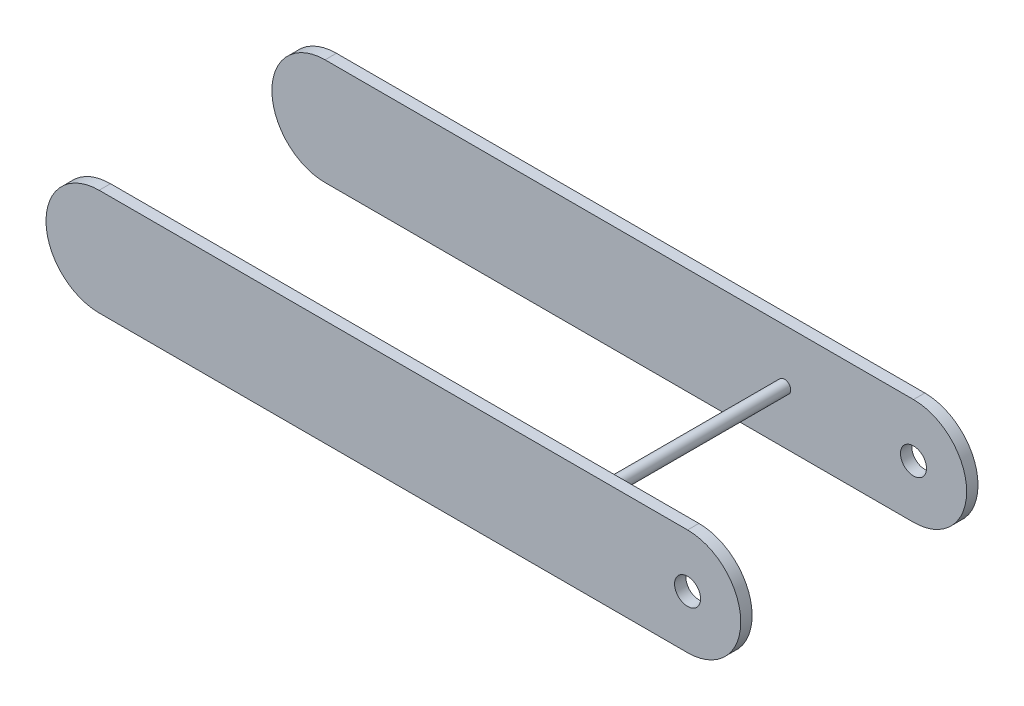
ISO-10303-21;
HEADER;
FILE_DESCRIPTION(('STEP AP214'),'2;1');
FILE_NAME('part.step','',(''),(''),'','','');
FILE_SCHEMA(('AUTOMOTIVE_DESIGN { 1 0 10303 214 1 1 1 1 }'));
ENDSEC;
DATA;
#1=APPLICATION_CONTEXT('core data for automotive mechanical design processes');
#2=APPLICATION_PROTOCOL_DEFINITION('international standard','automotive_design',2000,#1);
#3=PRODUCT_CONTEXT('',#1,'mechanical');
#4=PRODUCT('Part','Part','',(#3));
#5=PRODUCT_RELATED_PRODUCT_CATEGORY('part','',(#4));
#6=PRODUCT_DEFINITION_FORMATION('','',#4);
#7=PRODUCT_DEFINITION_CONTEXT('part definition',#1,'design');
#8=PRODUCT_DEFINITION('design','',#6,#7);
#9=PRODUCT_DEFINITION_SHAPE('','',#8);
#10=(LENGTH_UNIT() NAMED_UNIT(*) SI_UNIT(.MILLI.,.METRE.));
#11=(NAMED_UNIT(*) PLANE_ANGLE_UNIT() SI_UNIT($,.RADIAN.));
#12=(NAMED_UNIT(*) SI_UNIT($,.STERADIAN.) SOLID_ANGLE_UNIT());
#13=UNCERTAINTY_MEASURE_WITH_UNIT(LENGTH_MEASURE(1.E-05),#10,'distance_accuracy_value','');
#14=(GEOMETRIC_REPRESENTATION_CONTEXT(3) GLOBAL_UNCERTAINTY_ASSIGNED_CONTEXT((#13)) GLOBAL_UNIT_ASSIGNED_CONTEXT((#10,
#11,#12)) REPRESENTATION_CONTEXT('',''));
#15=CARTESIAN_POINT('',(0.,0.,0.));
#16=DIRECTION('',(0.,0.,1.));
#17=DIRECTION('',(1.,0.,0.));
#18=AXIS2_PLACEMENT_3D('',#15,#16,#17);
#19=CARTESIAN_POINT('',(-149.578947368421,-25.3,5.4));
#20=DIRECTION('',(0.,0.,1.));
#21=DIRECTION('',(1.,0.,0.));
#22=AXIS2_PLACEMENT_3D('',#19,#20,#21);
#23=PLANE('',#22);
#24=DIRECTION('',(-1.,0.,0.));
#25=VECTOR('',#24,1.);
#26=CARTESIAN_POINT('',(130.421052631579,0.,5.4));
#27=LINE('',#26,#25);
#28=CARTESIAN_POINT('',(130.421052631579,0.,5.4));
#29=VERTEX_POINT('',#28);
#30=CARTESIAN_POINT('',(-149.578947368421,0.,5.4));
#31=VERTEX_POINT('',#30);
#32=EDGE_CURVE('E80',#29,#31,#27,.T.);
#33=ORIENTED_EDGE('',*,*,#32,.T.);
#34=CARTESIAN_POINT('',(-149.578947368421,-25.3,5.4));
#35=DIRECTION('',(0.,0.,1.));
#36=DIRECTION('',(1.,0.,0.));
#37=AXIS2_PLACEMENT_3D('',#34,#35,#36);
#38=CIRCLE('',#37,25.3);
#39=CARTESIAN_POINT('',(-149.578947368421,-50.6,5.4));
#40=VERTEX_POINT('',#39);
#41=EDGE_CURVE('E149',#31,#40,#38,.T.);
#42=ORIENTED_EDGE('',*,*,#41,.T.);
#43=DIRECTION('',(1.,0.,0.));
#44=VECTOR('',#43,1.);
#45=CARTESIAN_POINT('',(-149.578947368421,-50.6,5.4));
#46=LINE('',#45,#44);
#47=CARTESIAN_POINT('',(130.421052631579,-50.6,5.4));
#48=VERTEX_POINT('',#47);
#49=EDGE_CURVE('E152',#40,#48,#46,.T.);
#50=ORIENTED_EDGE('',*,*,#49,.T.);
#51=CARTESIAN_POINT('',(130.421052631579,-25.3,5.4));
#52=DIRECTION('',(0.,0.,1.));
#53=DIRECTION('',(1.,0.,0.));
#54=AXIS2_PLACEMENT_3D('',#51,#52,#53);
#55=CIRCLE('',#54,25.3);
#56=EDGE_CURVE('E50',#48,#29,#55,.T.);
#57=ORIENTED_EDGE('',*,*,#56,.T.);
#58=EDGE_LOOP('',(#33,#42,#50,#57));
#59=FACE_BOUND('',#58,.T.);
#60=CARTESIAN_POINT('',(130.421052631579,-25.3,5.4));
#61=DIRECTION('',(0.,0.,1.));
#62=DIRECTION('',(1.,0.,0.));
#63=AXIS2_PLACEMENT_3D('',#60,#61,#62);
#64=CIRCLE('',#63,6.2);
#65=CARTESIAN_POINT('',(124.221052631579,-25.3,5.4));
#66=VERTEX_POINT('',#65);
#67=EDGE_CURVE('E143',#66,#66,#64,.T.);
#68=ORIENTED_EDGE('',*,*,#67,.F.);
#69=EDGE_LOOP('',(#68));
#70=FACE_BOUND('',#69,.T.);
#71=ADVANCED_FACE('F33',(#59,#70),#23,.T.);
#72=CARTESIAN_POINT('',(-149.578947368421,-25.3,0.));
#73=DIRECTION('',(0.,0.,1.));
#74=DIRECTION('',(1.,0.,0.));
#75=AXIS2_PLACEMENT_3D('',#72,#73,#74);
#76=PLANE('',#75);
#77=CARTESIAN_POINT('',(68.9858099662511,-25.3,0.));
#78=DIRECTION('',(0.,0.,1.));
#79=DIRECTION('',(1.,0.,0.));
#80=AXIS2_PLACEMENT_3D('',#77,#78,#79);
#81=CIRCLE('',#80,2.99999999999999);
#82=CARTESIAN_POINT('',(71.9858099662511,-25.3,0.));
#83=VERTEX_POINT('',#82);
#84=EDGE_CURVE('E11',#83,#83,#81,.F.);
#85=ORIENTED_EDGE('',*,*,#84,.F.);
#86=EDGE_LOOP('',(#85));
#87=FACE_BOUND('',#86,.T.);
#88=DIRECTION('',(-1.,0.,0.));
#89=VECTOR('',#88,1.);
#90=CARTESIAN_POINT('',(0.,0.,0.));
#91=LINE('',#90,#89);
#92=CARTESIAN_POINT('',(130.421052631579,0.,0.));
#93=VERTEX_POINT('',#92);
#94=CARTESIAN_POINT('',(-149.578947368421,0.,0.));
#95=VERTEX_POINT('',#94);
#96=EDGE_CURVE('E75',#93,#95,#91,.T.);
#97=ORIENTED_EDGE('',*,*,#96,.F.);
#98=CARTESIAN_POINT('',(130.421052631579,-25.3,0.));
#99=DIRECTION('',(0.,0.,1.));
#100=DIRECTION('',(1.,0.,0.));
#101=AXIS2_PLACEMENT_3D('',#98,#99,#100);
#102=CIRCLE('',#101,25.3);
#103=CARTESIAN_POINT('',(130.421052631579,-50.6,0.));
#104=VERTEX_POINT('',#103);
#105=EDGE_CURVE('E150',#104,#93,#102,.T.);
#106=ORIENTED_EDGE('',*,*,#105,.F.);
#107=DIRECTION('',(1.,0.,0.));
#108=VECTOR('',#107,1.);
#109=CARTESIAN_POINT('',(-149.578947368421,-50.6,0.));
#110=LINE('',#109,#108);
#111=CARTESIAN_POINT('',(-149.578947368421,-50.6,0.));
#112=VERTEX_POINT('',#111);
#113=EDGE_CURVE('E68',#112,#104,#110,.T.);
#114=ORIENTED_EDGE('',*,*,#113,.F.);
#115=CARTESIAN_POINT('',(-149.578947368421,-25.3,0.));
#116=DIRECTION('',(0.,0.,1.));
#117=DIRECTION('',(1.,0.,0.));
#118=AXIS2_PLACEMENT_3D('',#115,#116,#117);
#119=CIRCLE('',#118,25.3);
#120=EDGE_CURVE('E157',#95,#112,#119,.T.);
#121=ORIENTED_EDGE('',*,*,#120,.F.);
#122=EDGE_LOOP('',(#97,#106,#114,#121));
#123=FACE_BOUND('',#122,.T.);
#124=CARTESIAN_POINT('',(130.421052631579,-25.3,0.));
#125=DIRECTION('',(0.,0.,1.));
#126=DIRECTION('',(1.,0.,0.));
#127=AXIS2_PLACEMENT_3D('',#124,#125,#126);
#128=CIRCLE('',#127,6.2);
#129=CARTESIAN_POINT('',(124.221052631579,-25.3,0.));
#130=VERTEX_POINT('',#129);
#131=EDGE_CURVE('E137',#130,#130,#128,.T.);
#132=ORIENTED_EDGE('',*,*,#131,.T.);
#133=EDGE_LOOP('',(#132));
#134=FACE_BOUND('',#133,.T.);
#135=ADVANCED_FACE('F172',(#87,#123,#134),#76,.F.);
#136=CARTESIAN_POINT('',(0.,0.,5.4));
#137=DIRECTION('',(0.,-1.,0.));
#138=DIRECTION('',(0.,0.,-1.));
#139=AXIS2_PLACEMENT_3D('',#136,#137,#138);
#140=PLANE('',#139);
#141=ORIENTED_EDGE('',*,*,#96,.T.);
#142=DIRECTION('',(0.,0.,-1.));
#143=VECTOR('',#142,1.);
#144=CARTESIAN_POINT('',(-149.578947368421,0.,5.4));
#145=LINE('',#144,#143);
#146=EDGE_CURVE('E42',#31,#95,#145,.T.);
#147=ORIENTED_EDGE('',*,*,#146,.F.);
#148=ORIENTED_EDGE('',*,*,#32,.F.);
#149=DIRECTION('',(0.,0.,-1.));
#150=VECTOR('',#149,1.);
#151=CARTESIAN_POINT('',(130.421052631579,0.,5.4));
#152=LINE('',#151,#150);
#153=EDGE_CURVE('E155',#29,#93,#152,.T.);
#154=ORIENTED_EDGE('',*,*,#153,.T.);
#155=EDGE_LOOP('',(#141,#147,#148,#154));
#156=FACE_BOUND('',#155,.T.);
#157=ADVANCED_FACE('F35',(#156),#140,.F.);
#158=CARTESIAN_POINT('',(-149.578947368421,-25.3,5.4));
#159=DIRECTION('',(0.,0.,-1.));
#160=DIRECTION('',(-1.,0.,0.));
#161=AXIS2_PLACEMENT_3D('',#158,#159,#160);
#162=CYLINDRICAL_SURFACE('',#161,25.3);
#163=ORIENTED_EDGE('',*,*,#120,.T.);
#164=DIRECTION('',(0.,0.,-1.));
#165=VECTOR('',#164,1.);
#166=CARTESIAN_POINT('',(-149.578947368421,-50.6,5.4));
#167=LINE('',#166,#165);
#168=EDGE_CURVE('E165',#40,#112,#167,.T.);
#169=ORIENTED_EDGE('',*,*,#168,.F.);
#170=ORIENTED_EDGE('',*,*,#41,.F.);
#171=ORIENTED_EDGE('',*,*,#146,.T.);
#172=EDGE_LOOP('',(#163,#169,#170,#171));
#173=FACE_BOUND('',#172,.T.);
#174=ADVANCED_FACE('F169',(#173),#162,.T.);
#175=CARTESIAN_POINT('',(-149.578947368421,-50.6,5.4));
#176=DIRECTION('',(0.,1.,0.));
#177=DIRECTION('',(-1.,0.,0.));
#178=AXIS2_PLACEMENT_3D('',#175,#176,#177);
#179=PLANE('',#178);
#180=ORIENTED_EDGE('',*,*,#113,.T.);
#181=DIRECTION('',(0.,0.,-1.));
#182=VECTOR('',#181,1.);
#183=CARTESIAN_POINT('',(130.421052631579,-50.6,5.4));
#184=LINE('',#183,#182);
#185=EDGE_CURVE('E163',#48,#104,#184,.T.);
#186=ORIENTED_EDGE('',*,*,#185,.F.);
#187=ORIENTED_EDGE('',*,*,#49,.F.);
#188=ORIENTED_EDGE('',*,*,#168,.T.);
#189=EDGE_LOOP('',(#180,#186,#187,#188));
#190=FACE_BOUND('',#189,.T.);
#191=ADVANCED_FACE('F181',(#190),#179,.F.);
#192=CARTESIAN_POINT('',(130.421052631579,-25.3,5.4));
#193=DIRECTION('',(0.,0.,-1.));
#194=DIRECTION('',(-1.,0.,0.));
#195=AXIS2_PLACEMENT_3D('',#192,#193,#194);
#196=CYLINDRICAL_SURFACE('',#195,25.3);
#197=ORIENTED_EDGE('',*,*,#105,.T.);
#198=ORIENTED_EDGE('',*,*,#153,.F.);
#199=ORIENTED_EDGE('',*,*,#56,.F.);
#200=ORIENTED_EDGE('',*,*,#185,.T.);
#201=EDGE_LOOP('',(#197,#198,#199,#200));
#202=FACE_BOUND('',#201,.T.);
#203=ADVANCED_FACE('F175',(#202),#196,.T.);
#204=CARTESIAN_POINT('',(130.421052631579,-25.3,5.4));
#205=DIRECTION('',(0.,0.,-1.));
#206=DIRECTION('',(-1.,0.,0.));
#207=AXIS2_PLACEMENT_3D('',#204,#205,#206);
#208=CYLINDRICAL_SURFACE('',#207,6.2);
#209=CARTESIAN_POINT('',(124.221052631579,-25.3,5.4));
#210=CARTESIAN_POINT('',(124.221052631579,-25.3,5.34375));
#211=CARTESIAN_POINT('',(124.221052631579,-25.3,5.2875));
#212=CARTESIAN_POINT('',(124.221052631579,-25.3,5.175));
#213=CARTESIAN_POINT('',(124.221052631579,-25.3,5.11875));
#214=CARTESIAN_POINT('',(124.221052631579,-25.3,5.00625));
#215=CARTESIAN_POINT('',(124.221052631579,-25.3,4.95));
#216=CARTESIAN_POINT('',(124.221052631579,-25.3,4.8375));
#217=CARTESIAN_POINT('',(124.221052631579,-25.3,4.78125));
#218=CARTESIAN_POINT('',(124.221052631579,-25.3,4.66875));
#219=CARTESIAN_POINT('',(124.221052631579,-25.3,4.6125));
#220=CARTESIAN_POINT('',(124.221052631579,-25.3,4.5));
#221=CARTESIAN_POINT('',(124.221052631579,-25.3,4.44375));
#222=CARTESIAN_POINT('',(124.221052631579,-25.3,4.33125));
#223=CARTESIAN_POINT('',(124.221052631579,-25.3,4.275));
#224=CARTESIAN_POINT('',(124.221052631579,-25.3,4.1625));
#225=CARTESIAN_POINT('',(124.221052631579,-25.3,4.10625));
#226=CARTESIAN_POINT('',(124.221052631579,-25.3,3.99375));
#227=CARTESIAN_POINT('',(124.221052631579,-25.3,3.9375));
#228=CARTESIAN_POINT('',(124.221052631579,-25.3,3.825));
#229=CARTESIAN_POINT('',(124.221052631579,-25.3,3.76875));
#230=CARTESIAN_POINT('',(124.221052631579,-25.3,3.65625));
#231=CARTESIAN_POINT('',(124.221052631579,-25.3,3.6));
#232=CARTESIAN_POINT('',(124.221052631579,-25.3,3.4875));
#233=CARTESIAN_POINT('',(124.221052631579,-25.3,3.43125));
#234=CARTESIAN_POINT('',(124.221052631579,-25.3,3.31875));
#235=CARTESIAN_POINT('',(124.221052631579,-25.3,3.2625));
#236=CARTESIAN_POINT('',(124.221052631579,-25.3,3.15));
#237=CARTESIAN_POINT('',(124.221052631579,-25.3,3.09375));
#238=CARTESIAN_POINT('',(124.221052631579,-25.3,2.98125));
#239=CARTESIAN_POINT('',(124.221052631579,-25.3,2.925));
#240=CARTESIAN_POINT('',(124.221052631579,-25.3,2.8125));
#241=CARTESIAN_POINT('',(124.221052631579,-25.3,2.75625));
#242=CARTESIAN_POINT('',(124.221052631579,-25.3,2.64375));
#243=CARTESIAN_POINT('',(124.221052631579,-25.3,2.5875));
#244=CARTESIAN_POINT('',(124.221052631579,-25.3,2.475));
#245=CARTESIAN_POINT('',(124.221052631579,-25.3,2.41875));
#246=CARTESIAN_POINT('',(124.221052631579,-25.3,2.30625));
#247=CARTESIAN_POINT('',(124.221052631579,-25.3,2.25));
#248=CARTESIAN_POINT('',(124.221052631579,-25.3,2.1375));
#249=CARTESIAN_POINT('',(124.221052631579,-25.3,2.08125));
#250=CARTESIAN_POINT('',(124.221052631579,-25.3,1.96875));
#251=CARTESIAN_POINT('',(124.221052631579,-25.3,1.9125));
#252=CARTESIAN_POINT('',(124.221052631579,-25.3,1.8));
#253=CARTESIAN_POINT('',(124.221052631579,-25.3,1.74375));
#254=CARTESIAN_POINT('',(124.221052631579,-25.3,1.63125));
#255=CARTESIAN_POINT('',(124.221052631579,-25.3,1.575));
#256=CARTESIAN_POINT('',(124.221052631579,-25.3,1.4625));
#257=CARTESIAN_POINT('',(124.221052631579,-25.3,1.40625));
#258=CARTESIAN_POINT('',(124.221052631579,-25.3,1.29375));
#259=CARTESIAN_POINT('',(124.221052631579,-25.3,1.2375));
#260=CARTESIAN_POINT('',(124.221052631579,-25.3,1.125));
#261=CARTESIAN_POINT('',(124.221052631579,-25.3,1.06875));
#262=CARTESIAN_POINT('',(124.221052631579,-25.3,0.95625));
#263=CARTESIAN_POINT('',(124.221052631579,-25.3,0.9));
#264=CARTESIAN_POINT('',(124.221052631579,-25.3,0.7875));
#265=CARTESIAN_POINT('',(124.221052631579,-25.3,0.73125));
#266=CARTESIAN_POINT('',(124.221052631579,-25.3,0.618749999999999));
#267=CARTESIAN_POINT('',(124.221052631579,-25.3,0.562499999999999));
#268=CARTESIAN_POINT('',(124.221052631579,-25.3,0.449999999999999));
#269=CARTESIAN_POINT('',(124.221052631579,-25.3,0.393749999999999));
#270=CARTESIAN_POINT('',(124.221052631579,-25.3,0.281249999999999));
#271=CARTESIAN_POINT('',(124.221052631579,-25.3,0.225));
#272=CARTESIAN_POINT('',(124.221052631579,-25.3,0.112499999999999));
#273=CARTESIAN_POINT('',(124.221052631579,-25.3,0.0562499999999992));
#274=CARTESIAN_POINT('',(124.221052631579,-25.3,0.));
#275=B_SPLINE_CURVE_WITH_KNOTS('',3,(#209,#210,#211,#212,#213,#214,#215,#216,#217,#218,#219,
#220,#221,#222,#223,#224,#225,#226,#227,#228,#229,#230,#231,#232,#233,#234,#235,#236,#237,#238,
#239,#240,#241,#242,#243,#244,#245,#246,#247,#248,#249,#250,#251,#252,#253,#254,#255,#256,#257,
#258,#259,#260,#261,#262,#263,#264,#265,#266,#267,#268,#269,#270,#271,#272,#273,#274),
.UNSPECIFIED.,.F.,.F.,(4,2,2,2,2,2,2,2,2,2,2,2,2,2,2,2,2,2,2,2,2,2,2,2,2,2,2,2,2,2,2,2,4),(0.,
0.168750000000001,0.3375,0.506250000000001,0.675,0.843750000000001,1.0125,1.18125,1.35,1.51875,
1.6875,1.85625,2.025,2.19375,2.3625,2.53125,2.7,2.86875,3.0375,3.20625,3.375,3.54375,3.7125,
3.88125,4.05,4.21875,4.3875,4.55625,4.725,4.89375,5.0625,5.23125,5.4),.UNSPECIFIED.);
#276=EDGE_CURVE('BSEAM190',#66,#130,#275,.T.);
#277=ORIENTED_EDGE('',*,*,#67,.T.);
#278=ORIENTED_EDGE('',*,*,#131,.F.);
#279=ORIENTED_EDGE('',*,*,#276,.T.);
#280=ORIENTED_EDGE('',*,*,#276,.F.);
#281=EDGE_LOOP('',(#277,#279,#278,#280));
#282=FACE_BOUND('',#281,.T.);
#283=ADVANCED_FACE('F190',(#282),#208,.F.);
#284=CARTESIAN_POINT('',(68.9858099662511,-25.3,-102.1));
#285=DIRECTION('',(0.,0.,1.));
#286=DIRECTION('',(1.,0.,0.));
#287=AXIS2_PLACEMENT_3D('',#284,#285,#286);
#288=CYLINDRICAL_SURFACE('',#287,2.99999999999999);
#289=CARTESIAN_POINT('',(68.9858099662511,-25.3,-102.1));
#290=DIRECTION('',(0.,0.,-1.));
#291=DIRECTION('',(-1.,0.,0.));
#292=AXIS2_PLACEMENT_3D('',#289,#290,#291);
#293=CIRCLE('',#292,2.99999999999999);
#294=CARTESIAN_POINT('',(65.9858099662511,-25.3,-102.1));
#295=VERTEX_POINT('',#294);
#296=EDGE_CURVE('E134',#295,#295,#293,.T.);
#297=ORIENTED_EDGE('',*,*,#296,.F.);
#298=EDGE_LOOP('',(#297));
#299=FACE_BOUND('',#298,.T.);
#300=ORIENTED_EDGE('',*,*,#84,.T.);
#301=EDGE_LOOP('',(#300));
#302=FACE_BOUND('',#301,.T.);
#303=ADVANCED_FACE('F210',(#299,#302),#288,.T.);
#304=CARTESIAN_POINT('',(130.421052631579,-25.3,-107.5));
#305=DIRECTION('',(0.,0.,1.));
#306=DIRECTION('',(1.,0.,0.));
#307=AXIS2_PLACEMENT_3D('',#304,#305,#306);
#308=PLANE('',#307);
#309=CARTESIAN_POINT('',(130.421052631579,-25.3,-107.5));
#310=DIRECTION('',(0.,0.,-1.));
#311=DIRECTION('',(1.,0.,0.));
#312=AXIS2_PLACEMENT_3D('',#309,#310,#311);
#313=CIRCLE('',#312,25.3);
#314=CARTESIAN_POINT('',(130.421052631579,0.,-107.5));
#315=VERTEX_POINT('',#314);
#316=CARTESIAN_POINT('',(130.421052631579,-50.6,-107.5));
#317=VERTEX_POINT('',#316);
#318=EDGE_CURVE('E119',#315,#317,#313,.T.);
#319=ORIENTED_EDGE('',*,*,#318,.T.);
#320=DIRECTION('',(-1.,0.,0.));
#321=VECTOR('',#320,1.);
#322=CARTESIAN_POINT('',(-149.578947368421,-50.6,-107.5));
#323=LINE('',#322,#321);
#324=CARTESIAN_POINT('',(-149.578947368421,-50.6,-107.5));
#325=VERTEX_POINT('',#324);
#326=EDGE_CURVE('E108',#317,#325,#323,.T.);
#327=ORIENTED_EDGE('',*,*,#326,.T.);
#328=CARTESIAN_POINT('',(-149.578947368421,-25.3,-107.5));
#329=DIRECTION('',(0.,0.,-1.));
#330=DIRECTION('',(1.,0.,0.));
#331=AXIS2_PLACEMENT_3D('',#328,#329,#330);
#332=CIRCLE('',#331,25.3);
#333=CARTESIAN_POINT('',(-149.578947368421,0.,-107.5));
#334=VERTEX_POINT('',#333);
#335=EDGE_CURVE('E118',#325,#334,#332,.T.);
#336=ORIENTED_EDGE('',*,*,#335,.T.);
#337=DIRECTION('',(1.,0.,0.));
#338=VECTOR('',#337,1.);
#339=CARTESIAN_POINT('',(130.421052631579,0.,-107.5));
#340=LINE('',#339,#338);
#341=EDGE_CURVE('E125',#334,#315,#340,.T.);
#342=ORIENTED_EDGE('',*,*,#341,.T.);
#343=EDGE_LOOP('',(#319,#327,#336,#342));
#344=FACE_BOUND('',#343,.T.);
#345=CARTESIAN_POINT('',(130.421052631579,-25.3,-107.5));
#346=DIRECTION('',(0.,0.,-1.));
#347=DIRECTION('',(-1.,0.,0.));
#348=AXIS2_PLACEMENT_3D('',#345,#346,#347);
#349=CIRCLE('',#348,6.2);
#350=CARTESIAN_POINT('',(136.621052631579,-25.3,-107.5));
#351=VERTEX_POINT('',#350);
#352=EDGE_CURVE('E315',#351,#351,#349,.T.);
#353=ORIENTED_EDGE('',*,*,#352,.F.);
#354=EDGE_LOOP('',(#353));
#355=FACE_BOUND('',#354,.T.);
#356=ADVANCED_FACE('F122',(#344,#355),#308,.F.);
#357=CARTESIAN_POINT('',(130.421052631579,-25.3,-102.1));
#358=DIRECTION('',(0.,0.,1.));
#359=DIRECTION('',(1.,0.,0.));
#360=AXIS2_PLACEMENT_3D('',#357,#358,#359);
#361=PLANE('',#360);
#362=ORIENTED_EDGE('',*,*,#296,.T.);
#363=EDGE_LOOP('',(#362));
#364=FACE_BOUND('',#363,.T.);
#365=CARTESIAN_POINT('',(130.421052631579,-25.3,-102.1));
#366=DIRECTION('',(0.,0.,-1.));
#367=DIRECTION('',(1.,0.,0.));
#368=AXIS2_PLACEMENT_3D('',#365,#366,#367);
#369=CIRCLE('',#368,25.3);
#370=CARTESIAN_POINT('',(130.421052631579,0.,-102.1));
#371=VERTEX_POINT('',#370);
#372=CARTESIAN_POINT('',(130.421052631579,-50.6,-102.1));
#373=VERTEX_POINT('',#372);
#374=EDGE_CURVE('E133',#371,#373,#369,.T.);
#375=ORIENTED_EDGE('',*,*,#374,.F.);
#376=DIRECTION('',(1.,0.,0.));
#377=VECTOR('',#376,1.);
#378=CARTESIAN_POINT('',(130.421052631579,0.,-102.1));
#379=LINE('',#378,#377);
#380=CARTESIAN_POINT('',(-149.578947368421,0.,-102.1));
#381=VERTEX_POINT('',#380);
#382=EDGE_CURVE('E129',#381,#371,#379,.T.);
#383=ORIENTED_EDGE('',*,*,#382,.F.);
#384=CARTESIAN_POINT('',(-149.578947368421,-25.3,-102.1));
#385=DIRECTION('',(0.,0.,-1.));
#386=DIRECTION('',(1.,0.,0.));
#387=AXIS2_PLACEMENT_3D('',#384,#385,#386);
#388=CIRCLE('',#387,25.3);
#389=CARTESIAN_POINT('',(-149.578947368421,-50.6,-102.1));
#390=VERTEX_POINT('',#389);
#391=EDGE_CURVE('E329',#390,#381,#388,.T.);
#392=ORIENTED_EDGE('',*,*,#391,.F.);
#393=DIRECTION('',(-1.,0.,0.));
#394=VECTOR('',#393,1.);
#395=CARTESIAN_POINT('',(-149.578947368421,-50.6,-102.1));
#396=LINE('',#395,#394);
#397=EDGE_CURVE('E327',#373,#390,#396,.T.);
#398=ORIENTED_EDGE('',*,*,#397,.F.);
#399=EDGE_LOOP('',(#375,#383,#392,#398));
#400=FACE_BOUND('',#399,.T.);
#401=CARTESIAN_POINT('',(130.421052631579,-25.3,-102.1));
#402=DIRECTION('',(0.,0.,-1.));
#403=DIRECTION('',(-1.,0.,0.));
#404=AXIS2_PLACEMENT_3D('',#401,#402,#403);
#405=CIRCLE('',#404,6.2);
#406=CARTESIAN_POINT('',(136.621052631579,-25.3,-102.1));
#407=VERTEX_POINT('',#406);
#408=EDGE_CURVE('E318',#407,#407,#405,.T.);
#409=ORIENTED_EDGE('',*,*,#408,.T.);
#410=EDGE_LOOP('',(#409));
#411=FACE_BOUND('',#410,.T.);
#412=ADVANCED_FACE('F224',(#364,#400,#411),#361,.T.);
#413=CARTESIAN_POINT('',(130.421052631579,-25.3,-107.5));
#414=DIRECTION('',(0.,0.,1.));
#415=DIRECTION('',(1.,0.,0.));
#416=AXIS2_PLACEMENT_3D('',#413,#414,#415);
#417=CYLINDRICAL_SURFACE('',#416,25.3);
#418=ORIENTED_EDGE('',*,*,#374,.T.);
#419=DIRECTION('',(0.,0.,1.));
#420=VECTOR('',#419,1.);
#421=CARTESIAN_POINT('',(130.421052631579,-50.6,-107.5));
#422=LINE('',#421,#420);
#423=EDGE_CURVE('E112',#317,#373,#422,.T.);
#424=ORIENTED_EDGE('',*,*,#423,.F.);
#425=ORIENTED_EDGE('',*,*,#318,.F.);
#426=DIRECTION('',(0.,0.,1.));
#427=VECTOR('',#426,1.);
#428=CARTESIAN_POINT('',(130.421052631579,0.,-107.5));
#429=LINE('',#428,#427);
#430=EDGE_CURVE('E325',#315,#371,#429,.T.);
#431=ORIENTED_EDGE('',*,*,#430,.T.);
#432=EDGE_LOOP('',(#418,#424,#425,#431));
#433=FACE_BOUND('',#432,.T.);
#434=ADVANCED_FACE('F131',(#433),#417,.T.);
#435=CARTESIAN_POINT('',(-149.578947368421,-50.6,-107.5));
#436=DIRECTION('',(0.,1.,0.));
#437=DIRECTION('',(-1.,0.,0.));
#438=AXIS2_PLACEMENT_3D('',#435,#436,#437);
#439=PLANE('',#438);
#440=ORIENTED_EDGE('',*,*,#397,.T.);
#441=DIRECTION('',(0.,0.,1.));
#442=VECTOR('',#441,1.);
#443=CARTESIAN_POINT('',(-149.578947368421,-50.6,-107.5));
#444=LINE('',#443,#442);
#445=EDGE_CURVE('E115',#325,#390,#444,.T.);
#446=ORIENTED_EDGE('',*,*,#445,.F.);
#447=ORIENTED_EDGE('',*,*,#326,.F.);
#448=ORIENTED_EDGE('',*,*,#423,.T.);
#449=EDGE_LOOP('',(#440,#446,#447,#448));
#450=FACE_BOUND('',#449,.T.);
#451=ADVANCED_FACE('F110',(#450),#439,.F.);
#452=CARTESIAN_POINT('',(-149.578947368421,-25.3,-107.5));
#453=DIRECTION('',(0.,0.,1.));
#454=DIRECTION('',(1.,0.,0.));
#455=AXIS2_PLACEMENT_3D('',#452,#453,#454);
#456=CYLINDRICAL_SURFACE('',#455,25.3);
#457=ORIENTED_EDGE('',*,*,#391,.T.);
#458=DIRECTION('',(0.,0.,1.));
#459=VECTOR('',#458,1.);
#460=CARTESIAN_POINT('',(-149.578947368421,0.,-107.5));
#461=LINE('',#460,#459);
#462=EDGE_CURVE('E139',#334,#381,#461,.T.);
#463=ORIENTED_EDGE('',*,*,#462,.F.);
#464=ORIENTED_EDGE('',*,*,#335,.F.);
#465=ORIENTED_EDGE('',*,*,#445,.T.);
#466=EDGE_LOOP('',(#457,#463,#464,#465));
#467=FACE_BOUND('',#466,.T.);
#468=ADVANCED_FACE('F244',(#467),#456,.T.);
#469=CARTESIAN_POINT('',(130.421052631579,0.,-107.5));
#470=DIRECTION('',(0.,-1.,0.));
#471=DIRECTION('',(1.,0.,0.));
#472=AXIS2_PLACEMENT_3D('',#469,#470,#471);
#473=PLANE('',#472);
#474=ORIENTED_EDGE('',*,*,#382,.T.);
#475=ORIENTED_EDGE('',*,*,#430,.F.);
#476=ORIENTED_EDGE('',*,*,#341,.F.);
#477=ORIENTED_EDGE('',*,*,#462,.T.);
#478=EDGE_LOOP('',(#474,#475,#476,#477));
#479=FACE_BOUND('',#478,.T.);
#480=ADVANCED_FACE('F251',(#479),#473,.F.);
#481=CARTESIAN_POINT('',(130.421052631579,-25.3,-107.5));
#482=DIRECTION('',(0.,0.,1.));
#483=DIRECTION('',(1.,0.,0.));
#484=AXIS2_PLACEMENT_3D('',#481,#482,#483);
#485=CYLINDRICAL_SURFACE('',#484,6.2);
#486=CARTESIAN_POINT('',(136.621052631579,-25.3,-107.5));
#487=CARTESIAN_POINT('',(136.621052631579,-25.3,-107.44375));
#488=CARTESIAN_POINT('',(136.621052631579,-25.3,-107.3875));
#489=CARTESIAN_POINT('',(136.621052631579,-25.3,-107.275));
#490=CARTESIAN_POINT('',(136.621052631579,-25.3,-107.21875));
#491=CARTESIAN_POINT('',(136.621052631579,-25.3,-107.10625));
#492=CARTESIAN_POINT('',(136.621052631579,-25.3,-107.05));
#493=CARTESIAN_POINT('',(136.621052631579,-25.3,-106.9375));
#494=CARTESIAN_POINT('',(136.621052631579,-25.3,-106.88125));
#495=CARTESIAN_POINT('',(136.621052631579,-25.3,-106.76875));
#496=CARTESIAN_POINT('',(136.621052631579,-25.3,-106.7125));
#497=CARTESIAN_POINT('',(136.621052631579,-25.3,-106.6));
#498=CARTESIAN_POINT('',(136.621052631579,-25.3,-106.54375));
#499=CARTESIAN_POINT('',(136.621052631579,-25.3,-106.43125));
#500=CARTESIAN_POINT('',(136.621052631579,-25.3,-106.375));
#501=CARTESIAN_POINT('',(136.621052631579,-25.3,-106.2625));
#502=CARTESIAN_POINT('',(136.621052631579,-25.3,-106.20625));
#503=CARTESIAN_POINT('',(136.621052631579,-25.3,-106.09375));
#504=CARTESIAN_POINT('',(136.621052631579,-25.3,-106.0375));
#505=CARTESIAN_POINT('',(136.621052631579,-25.3,-105.925));
#506=CARTESIAN_POINT('',(136.621052631579,-25.3,-105.86875));
#507=CARTESIAN_POINT('',(136.621052631579,-25.3,-105.75625));
#508=CARTESIAN_POINT('',(136.621052631579,-25.3,-105.7));
#509=CARTESIAN_POINT('',(136.621052631579,-25.3,-105.5875));
#510=CARTESIAN_POINT('',(136.621052631579,-25.3,-105.53125));
#511=CARTESIAN_POINT('',(136.621052631579,-25.3,-105.41875));
#512=CARTESIAN_POINT('',(136.621052631579,-25.3,-105.3625));
#513=CARTESIAN_POINT('',(136.621052631579,-25.3,-105.25));
#514=CARTESIAN_POINT('',(136.621052631579,-25.3,-105.19375));
#515=CARTESIAN_POINT('',(136.621052631579,-25.3,-105.08125));
#516=CARTESIAN_POINT('',(136.621052631579,-25.3,-105.025));
#517=CARTESIAN_POINT('',(136.621052631579,-25.3,-104.9125));
#518=CARTESIAN_POINT('',(136.621052631579,-25.3,-104.85625));
#519=CARTESIAN_POINT('',(136.621052631579,-25.3,-104.74375));
#520=CARTESIAN_POINT('',(136.621052631579,-25.3,-104.6875));
#521=CARTESIAN_POINT('',(136.621052631579,-25.3,-104.575));
#522=CARTESIAN_POINT('',(136.621052631579,-25.3,-104.51875));
#523=CARTESIAN_POINT('',(136.621052631579,-25.3,-104.40625));
#524=CARTESIAN_POINT('',(136.621052631579,-25.3,-104.35));
#525=CARTESIAN_POINT('',(136.621052631579,-25.3,-104.2375));
#526=CARTESIAN_POINT('',(136.621052631579,-25.3,-104.18125));
#527=CARTESIAN_POINT('',(136.621052631579,-25.3,-104.06875));
#528=CARTESIAN_POINT('',(136.621052631579,-25.3,-104.0125));
#529=CARTESIAN_POINT('',(136.621052631579,-25.3,-103.9));
#530=CARTESIAN_POINT('',(136.621052631579,-25.3,-103.84375));
#531=CARTESIAN_POINT('',(136.621052631579,-25.3,-103.73125));
#532=CARTESIAN_POINT('',(136.621052631579,-25.3,-103.675));
#533=CARTESIAN_POINT('',(136.621052631579,-25.3,-103.5625));
#534=CARTESIAN_POINT('',(136.621052631579,-25.3,-103.50625));
#535=CARTESIAN_POINT('',(136.621052631579,-25.3,-103.39375));
#536=CARTESIAN_POINT('',(136.621052631579,-25.3,-103.3375));
#537=CARTESIAN_POINT('',(136.621052631579,-25.3,-103.225));
#538=CARTESIAN_POINT('',(136.621052631579,-25.3,-103.16875));
#539=CARTESIAN_POINT('',(136.621052631579,-25.3,-103.05625));
#540=CARTESIAN_POINT('',(136.621052631579,-25.3,-103.));
#541=CARTESIAN_POINT('',(136.621052631579,-25.3,-102.8875));
#542=CARTESIAN_POINT('',(136.621052631579,-25.3,-102.83125));
#543=CARTESIAN_POINT('',(136.621052631579,-25.3,-102.71875));
#544=CARTESIAN_POINT('',(136.621052631579,-25.3,-102.6625));
#545=CARTESIAN_POINT('',(136.621052631579,-25.3,-102.55));
#546=CARTESIAN_POINT('',(136.621052631579,-25.3,-102.49375));
#547=CARTESIAN_POINT('',(136.621052631579,-25.3,-102.38125));
#548=CARTESIAN_POINT('',(136.621052631579,-25.3,-102.325));
#549=CARTESIAN_POINT('',(136.621052631579,-25.3,-102.2125));
#550=CARTESIAN_POINT('',(136.621052631579,-25.3,-102.15625));
#551=CARTESIAN_POINT('',(136.621052631579,-25.3,-102.1));
#552=B_SPLINE_CURVE_WITH_KNOTS('',3,(#486,#487,#488,#489,#490,#491,#492,#493,#494,#495,#496,
#497,#498,#499,#500,#501,#502,#503,#504,#505,#506,#507,#508,#509,#510,#511,#512,#513,#514,#515,
#516,#517,#518,#519,#520,#521,#522,#523,#524,#525,#526,#527,#528,#529,#530,#531,#532,#533,#534,
#535,#536,#537,#538,#539,#540,#541,#542,#543,#544,#545,#546,#547,#548,#549,#550,#551),
.UNSPECIFIED.,.F.,.F.,(4,2,2,2,2,2,2,2,2,2,2,2,2,2,2,2,2,2,2,2,2,2,2,2,2,2,2,2,2,2,2,2,4),(0.,
0.168749999999995,0.337499999999991,0.50625,0.674999999999995,0.84374999999999,1.0125,
1.18124999999999,1.34999999999999,1.51875,1.68749999999999,1.85624999999999,2.025,
2.19374999999999,2.36249999999999,2.53125,2.69999999999999,2.86874999999999,3.0375,
3.20624999999999,3.37499999999999,3.54375,3.71249999999999,3.88124999999999,4.05,
4.21874999999999,4.38749999999999,4.55625,4.72499999999999,4.89374999999999,5.0625,
5.23124999999999,5.39999999999999),.UNSPECIFIED.);
#553=EDGE_CURVE('BSEAM259',#351,#407,#552,.T.);
#554=ORIENTED_EDGE('',*,*,#352,.T.);
#555=ORIENTED_EDGE('',*,*,#408,.F.);
#556=ORIENTED_EDGE('',*,*,#553,.T.);
#557=ORIENTED_EDGE('',*,*,#553,.F.);
#558=EDGE_LOOP('',(#554,#556,#555,#557));
#559=FACE_BOUND('',#558,.T.);
#560=ADVANCED_FACE('F259',(#559),#485,.F.);
#561=CLOSED_SHELL('',(#71,#135,#157,#174,#191,#203,#283,#303,#356,#412,#434,#451,#468,#480,#560));
#562=MANIFOLD_SOLID_BREP('B2',#561);
#563=ADVANCED_BREP_SHAPE_REPRESENTATION('',(#18,#562),#14);
#564=SHAPE_DEFINITION_REPRESENTATION(#9,#563);
ENDSEC;
END-ISO-10303-21;
